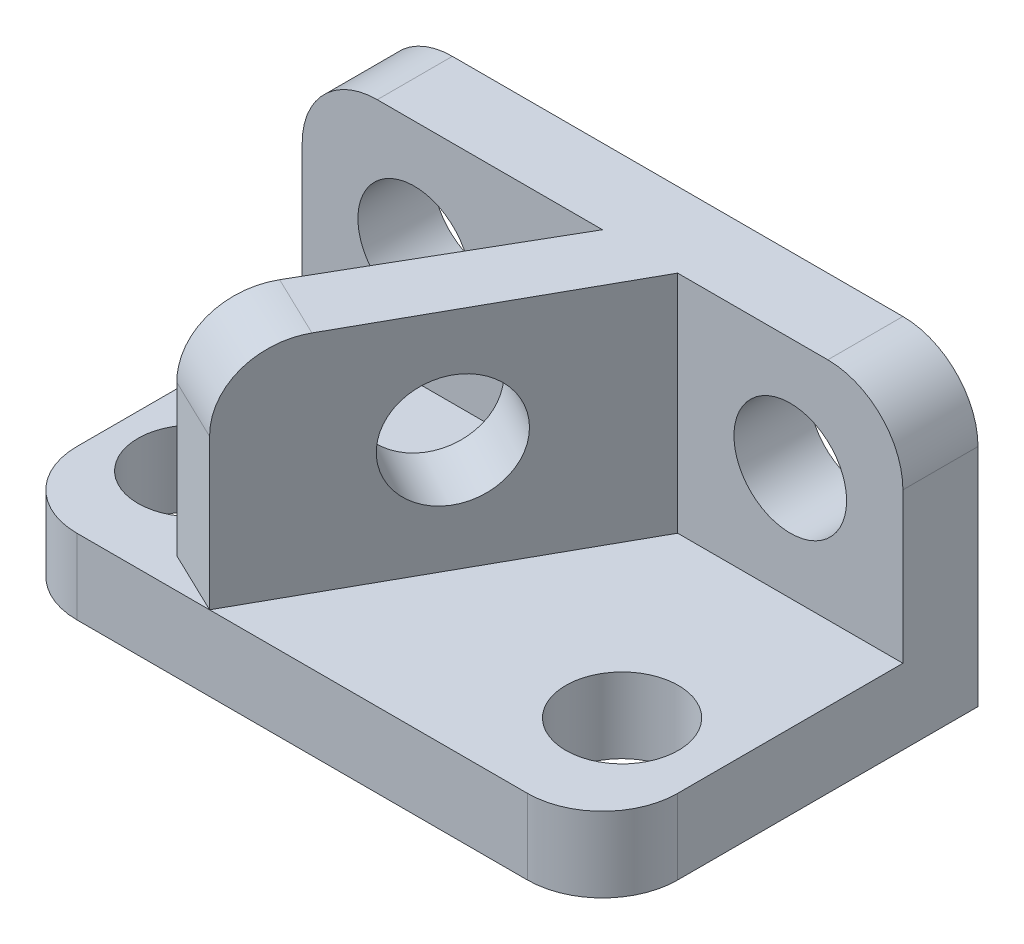
ISO-10303-21;
HEADER;
FILE_DESCRIPTION(('STEP AP214'),'2;1');
FILE_NAME('part.step','',(''),(''),'','','');
FILE_SCHEMA(('AUTOMOTIVE_DESIGN { 1 0 10303 214 1 1 1 1 }'));
ENDSEC;
DATA;
#1=APPLICATION_CONTEXT('core data for automotive mechanical design processes');
#2=APPLICATION_PROTOCOL_DEFINITION('international standard','automotive_design',2000,#1);
#3=PRODUCT_CONTEXT('',#1,'mechanical');
#4=PRODUCT('Part','Part','',(#3));
#5=PRODUCT_RELATED_PRODUCT_CATEGORY('part','',(#4));
#6=PRODUCT_DEFINITION_FORMATION('','',#4);
#7=PRODUCT_DEFINITION_CONTEXT('part definition',#1,'design');
#8=PRODUCT_DEFINITION('design','',#6,#7);
#9=PRODUCT_DEFINITION_SHAPE('','',#8);
#10=(LENGTH_UNIT() NAMED_UNIT(*) SI_UNIT(.MILLI.,.METRE.));
#11=(NAMED_UNIT(*) PLANE_ANGLE_UNIT() SI_UNIT($,.RADIAN.));
#12=(NAMED_UNIT(*) SI_UNIT($,.STERADIAN.) SOLID_ANGLE_UNIT());
#13=UNCERTAINTY_MEASURE_WITH_UNIT(LENGTH_MEASURE(1.E-05),#10,'distance_accuracy_value','');
#14=(GEOMETRIC_REPRESENTATION_CONTEXT(3) GLOBAL_UNCERTAINTY_ASSIGNED_CONTEXT((#13)) GLOBAL_UNIT_ASSIGNED_CONTEXT((#10,
#11,#12)) REPRESENTATION_CONTEXT('',''));
#15=CARTESIAN_POINT('',(0.,0.,0.));
#16=DIRECTION('',(0.,0.,1.));
#17=DIRECTION('',(1.,0.,0.));
#18=AXIS2_PLACEMENT_3D('',#15,#16,#17);
#19=CARTESIAN_POINT('',(-85.9782608695652,-40.,-14.2391304347826));
#20=DIRECTION('',(0.,0.,1.));
#21=DIRECTION('',(1.,0.,0.));
#22=AXIS2_PLACEMENT_3D('',#19,#20,#21);
#23=PLANE('',#22);
#24=CARTESIAN_POINT('',(-20.9782608695653,-15.,-14.2391304347826));
#25=DIRECTION('',(0.,0.,1.));
#26=DIRECTION('',(1.,0.,0.));
#27=AXIS2_PLACEMENT_3D('',#24,#25,#26);
#28=CIRCLE('',#27,7.5);
#29=CARTESIAN_POINT('',(-13.4782608695653,-15.,-14.2391304347826));
#30=VERTEX_POINT('',#29);
#31=EDGE_CURVE('E252',#30,#30,#28,.T.);
#32=ORIENTED_EDGE('',*,*,#31,.F.);
#33=EDGE_LOOP('',(#32));
#34=FACE_BOUND('',#33,.T.);
#35=DIRECTION('',(0.,1.,0.));
#36=VECTOR('',#35,1.);
#37=CARTESIAN_POINT('',(-5.97826086956525,-40.,-14.2391304347826));
#38=LINE('',#37,#36);
#39=CARTESIAN_POINT('',(-5.97826086956525,-30.,-14.2391304347826));
#40=VERTEX_POINT('',#39);
#41=CARTESIAN_POINT('',(-5.97826086956525,-10.,-14.2391304347826));
#42=VERTEX_POINT('',#41);
#43=EDGE_CURVE('E231',#40,#42,#38,.T.);
#44=ORIENTED_EDGE('',*,*,#43,.T.);
#45=CARTESIAN_POINT('',(-15.9782608695652,-10.,-14.2391304347826));
#46=DIRECTION('',(0.,0.,1.));
#47=DIRECTION('',(1.,0.,0.));
#48=AXIS2_PLACEMENT_3D('',#45,#46,#47);
#49=CIRCLE('',#48,10.);
#50=CARTESIAN_POINT('',(-15.9782608695652,0.,-14.2391304347826));
#51=VERTEX_POINT('',#50);
#52=EDGE_CURVE('E280',#42,#51,#49,.T.);
#53=ORIENTED_EDGE('',*,*,#52,.T.);
#54=DIRECTION('',(1.,0.,0.));
#55=VECTOR('',#54,1.);
#56=CARTESIAN_POINT('',(-85.9782608695652,0.,-14.2391304347826));
#57=LINE('',#56,#55);
#58=CARTESIAN_POINT('',(-35.9782608695653,0.,-14.2391304347826));
#59=VERTEX_POINT('',#58);
#60=EDGE_CURVE('E228',#59,#51,#57,.T.);
#61=ORIENTED_EDGE('',*,*,#60,.F.);
#62=DIRECTION('',(0.,-1.,0.));
#63=VECTOR('',#62,1.);
#64=CARTESIAN_POINT('',(-35.9782608695653,0.,-14.2391304347826));
#65=LINE('',#64,#63);
#66=CARTESIAN_POINT('',(-35.9782608695653,-30.,-14.2391304347826));
#67=VERTEX_POINT('',#66);
#68=EDGE_CURVE('E186',#59,#67,#65,.T.);
#69=ORIENTED_EDGE('',*,*,#68,.T.);
#70=DIRECTION('',(-1.,0.,0.));
#71=VECTOR('',#70,1.);
#72=CARTESIAN_POINT('',(-85.9782608695652,-30.,-14.2391304347826));
#73=LINE('',#72,#71);
#74=EDGE_CURVE('E202',#40,#67,#73,.T.);
#75=ORIENTED_EDGE('',*,*,#74,.F.);
#76=EDGE_LOOP('',(#44,#53,#61,#69,#75));
#77=FACE_BOUND('',#76,.T.);
#78=ADVANCED_FACE('F41',(#34,#77),#23,.T.);
#79=CARTESIAN_POINT('',(-71.0572154337967,-15.,-14.2391304347826));
#80=DIRECTION('',(0.,0.,1.));
#81=DIRECTION('',(1.,0.,0.));
#82=AXIS2_PLACEMENT_3D('',#79,#80,#81);
#83=CIRCLE('',#82,7.50000000000001);
#84=CARTESIAN_POINT('',(-63.5572154337967,-15.,-14.2391304347826));
#85=VERTEX_POINT('',#84);
#86=EDGE_CURVE('E449',#85,#85,#83,.T.);
#87=ORIENTED_EDGE('',*,*,#86,.F.);
#88=EDGE_LOOP('',(#87));
#89=FACE_BOUND('',#88,.T.);
#90=CARTESIAN_POINT('',(-75.9782608695653,0.,-14.2391304347826));
#91=VERTEX_POINT('',#90);
#92=CARTESIAN_POINT('',(-45.9782608695652,0.,-14.2391304347826));
#93=VERTEX_POINT('',#92);
#94=EDGE_CURVE('E216',#91,#93,#57,.T.);
#95=ORIENTED_EDGE('',*,*,#94,.F.);
#96=CARTESIAN_POINT('',(-75.9782608695653,-10.,-14.2391304347826));
#97=DIRECTION('',(0.,0.,1.));
#98=DIRECTION('',(1.,0.,0.));
#99=AXIS2_PLACEMENT_3D('',#96,#97,#98);
#100=CIRCLE('',#99,10.);
#101=CARTESIAN_POINT('',(-85.9782608695652,-10.,-14.2391304347826));
#102=VERTEX_POINT('',#101);
#103=EDGE_CURVE('E11',#91,#102,#100,.T.);
#104=ORIENTED_EDGE('',*,*,#103,.T.);
#105=DIRECTION('',(0.,1.,0.));
#106=VECTOR('',#105,1.);
#107=CARTESIAN_POINT('',(-85.9782608695652,-40.,-14.2391304347826));
#108=LINE('',#107,#106);
#109=CARTESIAN_POINT('',(-85.9782608695652,-30.,-14.2391304347826));
#110=VERTEX_POINT('',#109);
#111=EDGE_CURVE('E236',#110,#102,#108,.T.);
#112=ORIENTED_EDGE('',*,*,#111,.F.);
#113=CARTESIAN_POINT('',(-45.9782608695652,-30.,-14.2391304347826));
#114=VERTEX_POINT('',#113);
#115=EDGE_CURVE('E192',#114,#110,#73,.T.);
#116=ORIENTED_EDGE('',*,*,#115,.F.);
#117=DIRECTION('',(0.,-1.,0.));
#118=VECTOR('',#117,1.);
#119=CARTESIAN_POINT('',(-45.9782608695652,0.,-14.2391304347826));
#120=LINE('',#119,#118);
#121=EDGE_CURVE('E155',#93,#114,#120,.T.);
#122=ORIENTED_EDGE('',*,*,#121,.F.);
#123=EDGE_LOOP('',(#95,#104,#112,#116,#122));
#124=FACE_BOUND('',#123,.T.);
#125=ADVANCED_FACE('F336',(#89,#124),#23,.T.);
#126=CARTESIAN_POINT('',(-85.9782608695652,-30.,25.7608695652174));
#127=DIRECTION('',(0.,-1.,0.));
#128=DIRECTION('',(0.,0.,-1.));
#129=AXIS2_PLACEMENT_3D('',#126,#127,#128);
#130=PLANE('',#129);
#131=CARTESIAN_POINT('',(-18.3763957998835,-30.,10.7608695652174));
#132=DIRECTION('',(0.,1.,0.));
#133=DIRECTION('',(0.,0.,1.));
#134=AXIS2_PLACEMENT_3D('',#131,#132,#133);
#135=CIRCLE('',#134,7.5);
#136=CARTESIAN_POINT('',(-18.3763957998835,-30.,18.2608695652174));
#137=VERTEX_POINT('',#136);
#138=EDGE_CURVE('E438',#137,#137,#135,.T.);
#139=ORIENTED_EDGE('',*,*,#138,.F.);
#140=EDGE_LOOP('',(#139));
#141=FACE_BOUND('',#140,.T.);
#142=DIRECTION('',(-1.,0.,0.));
#143=VECTOR('',#142,1.);
#144=CARTESIAN_POINT('',(-85.9782608695652,-30.,25.7608695652174));
#145=LINE('',#144,#143);
#146=CARTESIAN_POINT('',(-15.9782608695652,-30.,25.7608695652174));
#147=VERTEX_POINT('',#146);
#148=CARTESIAN_POINT('',(-58.3128512287718,-30.,25.7608695652174));
#149=VERTEX_POINT('',#148);
#150=EDGE_CURVE('E193',#147,#149,#145,.T.);
#151=ORIENTED_EDGE('',*,*,#150,.F.);
#152=CARTESIAN_POINT('',(-15.9782608695652,-30.,15.7608695652174));
#153=DIRECTION('',(0.,-1.,0.));
#154=DIRECTION('',(0.,0.,-1.));
#155=AXIS2_PLACEMENT_3D('',#152,#153,#154);
#156=CIRCLE('',#155,10.);
#157=CARTESIAN_POINT('',(-5.97826086956525,-30.,15.7608695652174));
#158=VERTEX_POINT('',#157);
#159=EDGE_CURVE('E291',#147,#158,#156,.F.);
#160=ORIENTED_EDGE('',*,*,#159,.T.);
#161=DIRECTION('',(0.,0.,-1.));
#162=VECTOR('',#161,1.);
#163=CARTESIAN_POINT('',(-5.97826086956525,-30.,25.7608695652174));
#164=LINE('',#163,#162);
#165=EDGE_CURVE('E208',#158,#40,#164,.T.);
#166=ORIENTED_EDGE('',*,*,#165,.T.);
#167=ORIENTED_EDGE('',*,*,#74,.T.);
#168=DIRECTION('',(0.487516089824221,0.,-0.873114002958664));
#169=VECTOR('',#168,1.);
#170=CARTESIAN_POINT('',(-33.4882252076734,-30.,-18.698644796756));
#171=LINE('',#170,#169);
#172=EDGE_CURVE('E168',#149,#67,#171,.T.);
#173=ORIENTED_EDGE('',*,*,#172,.F.);
#174=EDGE_LOOP('',(#151,#160,#166,#167,#173));
#175=FACE_BOUND('',#174,.T.);
#176=ADVANCED_FACE('F342',(#141,#175),#130,.F.);
#177=CARTESIAN_POINT('',(-75.3589146694154,-30.,10.7608695652174));
#178=DIRECTION('',(0.,1.,0.));
#179=DIRECTION('',(0.,0.,1.));
#180=AXIS2_PLACEMENT_3D('',#177,#178,#179);
#181=CIRCLE('',#180,7.50000000000001);
#182=CARTESIAN_POINT('',(-75.3589146694154,-30.,18.2608695652174));
#183=VERTEX_POINT('',#182);
#184=EDGE_CURVE('E256',#183,#183,#181,.T.);
#185=ORIENTED_EDGE('',*,*,#184,.F.);
#186=EDGE_LOOP('',(#185));
#187=FACE_BOUND('',#186,.T.);
#188=DIRECTION('',(0.,0.,-1.));
#189=VECTOR('',#188,1.);
#190=CARTESIAN_POINT('',(-85.9782608695652,-30.,25.7608695652174));
#191=LINE('',#190,#189);
#192=CARTESIAN_POINT('',(-85.9782608695652,-30.,15.7608695652174));
#193=VERTEX_POINT('',#192);
#194=EDGE_CURVE('E201',#193,#110,#191,.T.);
#195=ORIENTED_EDGE('',*,*,#194,.F.);
#196=CARTESIAN_POINT('',(-75.9782608695653,-30.,15.7608695652174));
#197=DIRECTION('',(0.,-1.,0.));
#198=DIRECTION('',(0.,0.,-1.));
#199=AXIS2_PLACEMENT_3D('',#196,#197,#198);
#200=CIRCLE('',#199,10.);
#201=CARTESIAN_POINT('',(-75.9782608695653,-30.,25.7608695652174));
#202=VERTEX_POINT('',#201);
#203=EDGE_CURVE('E306',#193,#202,#200,.F.);
#204=ORIENTED_EDGE('',*,*,#203,.T.);
#205=EDGE_CURVE('E166',#149,#202,#145,.T.);
#206=ORIENTED_EDGE('',*,*,#205,.F.);
#207=DIRECTION('',(0.900994385998586,0.,0.433830746258296));
#208=VECTOR('',#207,1.);
#209=CARTESIAN_POINT('',(-21.0443948614313,-30.,43.7057119404766));
#210=LINE('',#209,#208);
#211=CARTESIAN_POINT('',(-66.7318333132097,-30.,21.7071114761712));
#212=VERTEX_POINT('',#211);
#213=EDGE_CURVE('E150',#212,#149,#210,.T.);
#214=ORIENTED_EDGE('',*,*,#213,.F.);
#215=DIRECTION('',(-0.499999999999998,0.,0.86602540378444));
#216=VECTOR('',#215,1.);
#217=CARTESIAN_POINT('',(-40.649419994335,-30.,-23.4689535761313));
#218=LINE('',#217,#216);
#219=EDGE_CURVE('E163',#114,#212,#218,.T.);
#220=ORIENTED_EDGE('',*,*,#219,.F.);
#221=ORIENTED_EDGE('',*,*,#115,.T.);
#222=EDGE_LOOP('',(#195,#204,#206,#214,#220,#221));
#223=FACE_BOUND('',#222,.T.);
#224=ADVANCED_FACE('F161',(#187,#223),#130,.F.);
#225=CARTESIAN_POINT('',(-5.97826086956525,-40.,-24.2391304347826));
#226=DIRECTION('',(1.,0.,0.));
#227=DIRECTION('',(0.,0.,-1.));
#228=AXIS2_PLACEMENT_3D('',#225,#226,#227);
#229=PLANE('',#228);
#230=DIRECTION('',(0.,1.,0.));
#231=VECTOR('',#230,1.);
#232=CARTESIAN_POINT('',(-5.97826086956525,-40.,-24.2391304347826));
#233=LINE('',#232,#231);
#234=CARTESIAN_POINT('',(-5.97826086956525,-40.,-24.2391304347826));
#235=VERTEX_POINT('',#234);
#236=CARTESIAN_POINT('',(-5.97826086956525,-10.,-24.2391304347826));
#237=VERTEX_POINT('',#236);
#238=EDGE_CURVE('E224',#235,#237,#233,.T.);
#239=ORIENTED_EDGE('',*,*,#238,.T.);
#240=DIRECTION('',(0.,0.,-1.));
#241=VECTOR('',#240,1.);
#242=CARTESIAN_POINT('',(-5.97826086956525,-10.,-24.2391304347826));
#243=LINE('',#242,#241);
#244=EDGE_CURVE('E277',#237,#42,#243,.F.);
#245=ORIENTED_EDGE('',*,*,#244,.T.);
#246=ORIENTED_EDGE('',*,*,#43,.F.);
#247=ORIENTED_EDGE('',*,*,#165,.F.);
#248=DIRECTION('',(0.,1.,0.));
#249=VECTOR('',#248,1.);
#250=CARTESIAN_POINT('',(-5.97826086956525,-40.,15.7608695652174));
#251=LINE('',#250,#249);
#252=CARTESIAN_POINT('',(-5.97826086956525,-40.,15.7608695652174));
#253=VERTEX_POINT('',#252);
#254=EDGE_CURVE('E274',#158,#253,#251,.F.);
#255=ORIENTED_EDGE('',*,*,#254,.T.);
#256=DIRECTION('',(0.,0.,-1.));
#257=VECTOR('',#256,1.);
#258=CARTESIAN_POINT('',(-5.97826086956525,-40.,-24.2391304347826));
#259=LINE('',#258,#257);
#260=EDGE_CURVE('E212',#253,#235,#259,.T.);
#261=ORIENTED_EDGE('',*,*,#260,.T.);
#262=EDGE_LOOP('',(#239,#245,#246,#247,#255,#261));
#263=FACE_BOUND('',#262,.T.);
#264=ADVANCED_FACE('F353',(#263),#229,.T.);
#265=CARTESIAN_POINT('',(-85.9782608695652,-40.,-24.2391304347826));
#266=DIRECTION('',(-1.,0.,0.));
#267=DIRECTION('',(0.,0.,1.));
#268=AXIS2_PLACEMENT_3D('',#265,#266,#267);
#269=PLANE('',#268);
#270=DIRECTION('',(0.,0.,1.));
#271=VECTOR('',#270,1.);
#272=CARTESIAN_POINT('',(-85.9782608695652,-40.,-24.2391304347826));
#273=LINE('',#272,#271);
#274=CARTESIAN_POINT('',(-85.9782608695652,-40.,-24.2391304347826));
#275=VERTEX_POINT('',#274);
#276=CARTESIAN_POINT('',(-85.9782608695652,-40.,15.7608695652174));
#277=VERTEX_POINT('',#276);
#278=EDGE_CURVE('E220',#275,#277,#273,.T.);
#279=ORIENTED_EDGE('',*,*,#278,.T.);
#280=DIRECTION('',(0.,-1.,0.));
#281=VECTOR('',#280,1.);
#282=CARTESIAN_POINT('',(-85.9782608695652,-40.,15.7608695652174));
#283=LINE('',#282,#281);
#284=EDGE_CURVE('E303',#277,#193,#283,.F.);
#285=ORIENTED_EDGE('',*,*,#284,.T.);
#286=ORIENTED_EDGE('',*,*,#194,.T.);
#287=ORIENTED_EDGE('',*,*,#111,.T.);
#288=DIRECTION('',(0.,0.,1.));
#289=VECTOR('',#288,1.);
#290=CARTESIAN_POINT('',(-85.9782608695652,-10.,-24.2391304347826));
#291=LINE('',#290,#289);
#292=CARTESIAN_POINT('',(-85.9782608695652,-10.,-24.2391304347826));
#293=VERTEX_POINT('',#292);
#294=EDGE_CURVE('E300',#102,#293,#291,.F.);
#295=ORIENTED_EDGE('',*,*,#294,.T.);
#296=DIRECTION('',(0.,1.,0.));
#297=VECTOR('',#296,1.);
#298=CARTESIAN_POINT('',(-85.9782608695652,-40.,-24.2391304347826));
#299=LINE('',#298,#297);
#300=EDGE_CURVE('E240',#275,#293,#299,.T.);
#301=ORIENTED_EDGE('',*,*,#300,.F.);
#302=EDGE_LOOP('',(#279,#285,#286,#287,#295,#301));
#303=FACE_BOUND('',#302,.T.);
#304=ADVANCED_FACE('F349',(#303),#269,.T.);
#305=CARTESIAN_POINT('',(-85.9782608695652,-40.,-24.2391304347826));
#306=DIRECTION('',(0.,0.,-1.));
#307=DIRECTION('',(-1.,0.,0.));
#308=AXIS2_PLACEMENT_3D('',#305,#306,#307);
#309=PLANE('',#308);
#310=CARTESIAN_POINT('',(-20.9782608695653,-15.,-24.2391304347826));
#311=DIRECTION('',(0.,0.,-1.));
#312=DIRECTION('',(-1.,0.,0.));
#313=AXIS2_PLACEMENT_3D('',#310,#311,#312);
#314=CIRCLE('',#313,7.5);
#315=CARTESIAN_POINT('',(-28.4782608695653,-15.,-24.2391304347826));
#316=VERTEX_POINT('',#315);
#317=EDGE_CURVE('E251',#316,#316,#314,.T.);
#318=ORIENTED_EDGE('',*,*,#317,.F.);
#319=EDGE_LOOP('',(#318));
#320=FACE_BOUND('',#319,.T.);
#321=CARTESIAN_POINT('',(-71.0572154337967,-15.,-24.2391304347826));
#322=DIRECTION('',(0.,0.,-1.));
#323=DIRECTION('',(-1.,0.,0.));
#324=AXIS2_PLACEMENT_3D('',#321,#322,#323);
#325=CIRCLE('',#324,7.50000000000001);
#326=CARTESIAN_POINT('',(-78.5572154337967,-15.,-24.2391304347826));
#327=VERTEX_POINT('',#326);
#328=EDGE_CURVE('E247',#327,#327,#325,.T.);
#329=ORIENTED_EDGE('',*,*,#328,.F.);
#330=EDGE_LOOP('',(#329));
#331=FACE_BOUND('',#330,.T.);
#332=DIRECTION('',(-1.,0.,0.));
#333=VECTOR('',#332,1.);
#334=CARTESIAN_POINT('',(-85.9782608695652,0.,-24.2391304347826));
#335=LINE('',#334,#333);
#336=CARTESIAN_POINT('',(-15.9782608695652,0.,-24.2391304347826));
#337=VERTEX_POINT('',#336);
#338=CARTESIAN_POINT('',(-75.9782608695653,0.,-24.2391304347826));
#339=VERTEX_POINT('',#338);
#340=EDGE_CURVE('E211',#337,#339,#335,.T.);
#341=ORIENTED_EDGE('',*,*,#340,.F.);
#342=CARTESIAN_POINT('',(-15.9782608695652,-10.,-24.2391304347826));
#343=DIRECTION('',(0.,0.,-1.));
#344=DIRECTION('',(-1.,0.,0.));
#345=AXIS2_PLACEMENT_3D('',#342,#343,#344);
#346=CIRCLE('',#345,10.);
#347=EDGE_CURVE('E271',#337,#237,#346,.T.);
#348=ORIENTED_EDGE('',*,*,#347,.T.);
#349=ORIENTED_EDGE('',*,*,#238,.F.);
#350=DIRECTION('',(-1.,0.,0.));
#351=VECTOR('',#350,1.);
#352=CARTESIAN_POINT('',(-85.9782608695652,-40.,-24.2391304347826));
#353=LINE('',#352,#351);
#354=EDGE_CURVE('E215',#235,#275,#353,.T.);
#355=ORIENTED_EDGE('',*,*,#354,.T.);
#356=ORIENTED_EDGE('',*,*,#300,.T.);
#357=CARTESIAN_POINT('',(-75.9782608695653,-10.,-24.2391304347826));
#358=DIRECTION('',(0.,0.,-1.));
#359=DIRECTION('',(-1.,0.,0.));
#360=AXIS2_PLACEMENT_3D('',#357,#358,#359);
#361=CIRCLE('',#360,10.);
#362=EDGE_CURVE('E268',#293,#339,#361,.T.);
#363=ORIENTED_EDGE('',*,*,#362,.T.);
#364=EDGE_LOOP('',(#341,#348,#349,#355,#356,#363));
#365=FACE_BOUND('',#364,.T.);
#366=ADVANCED_FACE('F352',(#320,#331,#365),#309,.T.);
#367=CARTESIAN_POINT('',(0.,-40.,0.));
#368=DIRECTION('',(0.,1.,0.));
#369=DIRECTION('',(0.,0.,1.));
#370=AXIS2_PLACEMENT_3D('',#367,#368,#369);
#371=PLANE('',#370);
#372=CARTESIAN_POINT('',(-18.3763957998835,-40.,10.7608695652174));
#373=DIRECTION('',(0.,1.,0.));
#374=DIRECTION('',(0.,0.,1.));
#375=AXIS2_PLACEMENT_3D('',#372,#373,#374);
#376=CIRCLE('',#375,7.5);
#377=CARTESIAN_POINT('',(-18.3763957998835,-40.,18.2608695652174));
#378=VERTEX_POINT('',#377);
#379=EDGE_CURVE('E169',#378,#378,#376,.T.);
#380=ORIENTED_EDGE('',*,*,#379,.T.);
#381=EDGE_LOOP('',(#380));
#382=FACE_BOUND('',#381,.T.);
#383=CARTESIAN_POINT('',(-75.3589146694154,-40.,10.7608695652174));
#384=DIRECTION('',(0.,1.,0.));
#385=DIRECTION('',(0.,0.,1.));
#386=AXIS2_PLACEMENT_3D('',#383,#384,#385);
#387=CIRCLE('',#386,7.50000000000001);
#388=CARTESIAN_POINT('',(-75.3589146694154,-40.,18.2608695652174));
#389=VERTEX_POINT('',#388);
#390=EDGE_CURVE('E435',#389,#389,#387,.T.);
#391=ORIENTED_EDGE('',*,*,#390,.T.);
#392=EDGE_LOOP('',(#391));
#393=FACE_BOUND('',#392,.T.);
#394=ORIENTED_EDGE('',*,*,#260,.F.);
#395=CARTESIAN_POINT('',(-15.9782608695652,-40.,15.7608695652174));
#396=DIRECTION('',(0.,1.,0.));
#397=DIRECTION('',(0.,0.,1.));
#398=AXIS2_PLACEMENT_3D('',#395,#396,#397);
#399=CIRCLE('',#398,10.);
#400=CARTESIAN_POINT('',(-15.9782608695652,-40.,25.7608695652174));
#401=VERTEX_POINT('',#400);
#402=EDGE_CURVE('E297',#253,#401,#399,.F.);
#403=ORIENTED_EDGE('',*,*,#402,.T.);
#404=DIRECTION('',(1.,0.,0.));
#405=VECTOR('',#404,1.);
#406=CARTESIAN_POINT('',(-85.9782608695652,-40.,25.7608695652174));
#407=LINE('',#406,#405);
#408=CARTESIAN_POINT('',(-75.9782608695653,-40.,25.7608695652174));
#409=VERTEX_POINT('',#408);
#410=EDGE_CURVE('E197',#409,#401,#407,.T.);
#411=ORIENTED_EDGE('',*,*,#410,.F.);
#412=CARTESIAN_POINT('',(-75.9782608695653,-40.,15.7608695652174));
#413=DIRECTION('',(0.,1.,0.));
#414=DIRECTION('',(0.,0.,1.));
#415=AXIS2_PLACEMENT_3D('',#412,#413,#414);
#416=CIRCLE('',#415,10.);
#417=EDGE_CURVE('E294',#409,#277,#416,.F.);
#418=ORIENTED_EDGE('',*,*,#417,.T.);
#419=ORIENTED_EDGE('',*,*,#278,.F.);
#420=ORIENTED_EDGE('',*,*,#354,.F.);
#421=EDGE_LOOP('',(#394,#403,#411,#418,#419,#420));
#422=FACE_BOUND('',#421,.T.);
#423=ADVANCED_FACE('F357',(#382,#393,#422),#371,.F.);
#424=CARTESIAN_POINT('',(0.,0.,0.));
#425=DIRECTION('',(0.,1.,0.));
#426=DIRECTION('',(0.,0.,1.));
#427=AXIS2_PLACEMENT_3D('',#424,#425,#426);
#428=PLANE('',#427);
#429=ORIENTED_EDGE('',*,*,#60,.T.);
#430=DIRECTION('',(0.,0.,-1.));
#431=VECTOR('',#430,1.);
#432=CARTESIAN_POINT('',(-15.9782608695652,0.,0.));
#433=LINE('',#432,#431);
#434=EDGE_CURVE('E264',#51,#337,#433,.T.);
#435=ORIENTED_EDGE('',*,*,#434,.T.);
#436=ORIENTED_EDGE('',*,*,#340,.T.);
#437=DIRECTION('',(0.,0.,1.));
#438=VECTOR('',#437,1.);
#439=CARTESIAN_POINT('',(-75.9782608695653,0.,0.));
#440=LINE('',#439,#438);
#441=EDGE_CURVE('E235',#339,#91,#440,.T.);
#442=ORIENTED_EDGE('',*,*,#441,.T.);
#443=ORIENTED_EDGE('',*,*,#94,.T.);
#444=DIRECTION('',(-0.499999999999998,0.,0.86602540378444));
#445=VECTOR('',#444,1.);
#446=CARTESIAN_POINT('',(-40.649419994335,0.,-23.4689535761313));
#447=LINE('',#446,#445);
#448=CARTESIAN_POINT('',(-61.7177909866264,0.,13.0225354152279));
#449=VERTEX_POINT('',#448);
#450=EDGE_CURVE('E156',#93,#449,#447,.T.);
#451=ORIENTED_EDGE('',*,*,#450,.T.);
#452=DIRECTION('',(0.900994385998586,0.,0.433830746258296));
#453=VECTOR('',#452,1.);
#454=CARTESIAN_POINT('',(-53.9745437661889,0.,16.7509257052315));
#455=LINE('',#454,#453);
#456=CARTESIAN_POINT('',(-53.4287538196666,0.,17.0137247453583));
#457=VERTEX_POINT('',#456);
#458=EDGE_CURVE('E260',#449,#457,#455,.T.);
#459=ORIENTED_EDGE('',*,*,#458,.T.);
#460=DIRECTION('',(0.487516089824221,0.,-0.873114002958664));
#461=VECTOR('',#460,1.);
#462=CARTESIAN_POINT('',(-33.4882252076734,0.,-18.698644796756));
#463=LINE('',#462,#461);
#464=EDGE_CURVE('E176',#457,#59,#463,.T.);
#465=ORIENTED_EDGE('',*,*,#464,.T.);
#466=EDGE_LOOP('',(#429,#435,#436,#442,#443,#451,#459,#465));
#467=FACE_BOUND('',#466,.T.);
#468=ADVANCED_FACE('F319',(#467),#428,.T.);
#469=CARTESIAN_POINT('',(0.,0.,25.7608695652174));
#470=DIRECTION('',(0.,0.,1.));
#471=DIRECTION('',(1.,0.,0.));
#472=AXIS2_PLACEMENT_3D('',#469,#470,#471);
#473=PLANE('',#472);
#474=ORIENTED_EDGE('',*,*,#410,.T.);
#475=DIRECTION('',(0.,1.,0.));
#476=VECTOR('',#475,1.);
#477=CARTESIAN_POINT('',(-15.9782608695652,0.,25.7608695652174));
#478=LINE('',#477,#476);
#479=EDGE_CURVE('E287',#401,#147,#478,.T.);
#480=ORIENTED_EDGE('',*,*,#479,.T.);
#481=ORIENTED_EDGE('',*,*,#150,.T.);
#482=ORIENTED_EDGE('',*,*,#205,.T.);
#483=DIRECTION('',(0.,-1.,0.));
#484=VECTOR('',#483,1.);
#485=CARTESIAN_POINT('',(-75.9782608695653,0.,25.7608695652174));
#486=LINE('',#485,#484);
#487=EDGE_CURVE('E283',#202,#409,#486,.T.);
#488=ORIENTED_EDGE('',*,*,#487,.T.);
#489=EDGE_LOOP('',(#474,#480,#481,#482,#488));
#490=FACE_BOUND('',#489,.T.);
#491=ADVANCED_FACE('F379',(#490),#473,.T.);
#492=CARTESIAN_POINT('',(-21.0443948614313,0.,43.7057119404766));
#493=DIRECTION('',(0.433830746258296,0.,-0.900994385998586));
#494=DIRECTION('',(-0.900994385998586,0.,-0.433830746258296));
#495=AXIS2_PLACEMENT_3D('',#492,#493,#494);
#496=PLANE('',#495);
#497=DIRECTION('',(0.,-1.,0.));
#498=VECTOR('',#497,1.);
#499=CARTESIAN_POINT('',(-58.3128512287718,0.,25.7608695652174));
#500=LINE('',#499,#498);
#501=CARTESIAN_POINT('',(-58.3128512287718,-10.,25.7608695652174));
#502=VERTEX_POINT('',#501);
#503=EDGE_CURVE('E189',#502,#149,#500,.T.);
#504=ORIENTED_EDGE('',*,*,#503,.F.);
#505=DIRECTION('',(0.900994385998586,0.,0.433830746258296));
#506=VECTOR('',#505,1.);
#507=CARTESIAN_POINT('',(-66.7318333132097,-10.,21.7071114761712));
#508=LINE('',#507,#506);
#509=CARTESIAN_POINT('',(-66.7318333132097,-10.,21.7071114761712));
#510=VERTEX_POINT('',#509);
#511=EDGE_CURVE('E58',#502,#510,#508,.F.);
#512=ORIENTED_EDGE('',*,*,#511,.T.);
#513=DIRECTION('',(0.,-1.,0.));
#514=VECTOR('',#513,1.);
#515=CARTESIAN_POINT('',(-66.7318333132097,0.,21.7071114761712));
#516=LINE('',#515,#514);
#517=EDGE_CURVE('E147',#510,#212,#516,.T.);
#518=ORIENTED_EDGE('',*,*,#517,.T.);
#519=ORIENTED_EDGE('',*,*,#213,.T.);
#520=EDGE_LOOP('',(#504,#512,#518,#519));
#521=FACE_BOUND('',#520,.T.);
#522=ADVANCED_FACE('F149',(#521),#496,.F.);
#523=CARTESIAN_POINT('',(-33.4882252076734,0.,-18.698644796756));
#524=DIRECTION('',(-0.873114002958664,0.,-0.487516089824221));
#525=DIRECTION('',(-0.487516089824221,0.,0.873114002958664));
#526=AXIS2_PLACEMENT_3D('',#523,#524,#525);
#527=PLANE('',#526);
#528=CARTESIAN_POINT('',(-46.7036148456981,-15.,4.96937763030798));
#529=DIRECTION('',(0.873114002958664,0.,0.487516089824221));
#530=DIRECTION('',(0.487516089824221,0.,-0.873114002958664));
#531=AXIS2_PLACEMENT_3D('',#528,#529,#530);
#532=CIRCLE('',#531,7.5);
#533=CARTESIAN_POINT('',(-43.0472441720165,-15.,-1.578977391882));
#534=VERTEX_POINT('',#533);
#535=EDGE_CURVE('E456',#534,#534,#532,.T.);
#536=ORIENTED_EDGE('',*,*,#535,.F.);
#537=EDGE_LOOP('',(#536));
#538=FACE_BOUND('',#537,.T.);
#539=ORIENTED_EDGE('',*,*,#464,.F.);
#540=CARTESIAN_POINT('',(-53.4287538196666,-10.,17.0137247453583));
#541=DIRECTION('',(-0.873114002958664,0.,-0.487516089824221));
#542=DIRECTION('',(-0.487516089824221,0.,0.873114002958664));
#543=AXIS2_PLACEMENT_3D('',#540,#541,#542);
#544=ELLIPSE('',#543,10.0183306993339,10.);
#545=EDGE_CURVE('E66',#457,#502,#544,.F.);
#546=ORIENTED_EDGE('',*,*,#545,.T.);
#547=ORIENTED_EDGE('',*,*,#503,.T.);
#548=ORIENTED_EDGE('',*,*,#172,.T.);
#549=ORIENTED_EDGE('',*,*,#68,.F.);
#550=EDGE_LOOP('',(#539,#546,#547,#548,#549));
#551=FACE_BOUND('',#550,.T.);
#552=ADVANCED_FACE('F406',(#538,#551),#527,.F.);
#553=CARTESIAN_POINT('',(-40.649419994335,0.,-23.4689535761313));
#554=DIRECTION('',(0.86602540378444,0.,0.499999999999998));
#555=DIRECTION('',(0.499999999999998,0.,-0.86602540378444));
#556=AXIS2_PLACEMENT_3D('',#553,#554,#555);
#557=PLANE('',#556);
#558=CARTESIAN_POINT('',(-54.5415628526638,-15.,0.59294368049952));
#559=DIRECTION('',(0.86602540378444,0.,0.499999999999998));
#560=DIRECTION('',(0.499999999999998,0.,-0.86602540378444));
#561=AXIS2_PLACEMENT_3D('',#558,#559,#560);
#562=ELLIPSE('',#561,7.50077294059331,7.5);
#563=CARTESIAN_POINT('',(-50.7911763823672,-15.,-5.9029162340732));
#564=VERTEX_POINT('',#563);
#565=EDGE_CURVE('E45',#564,#564,#562,.T.);
#566=ORIENTED_EDGE('',*,*,#565,.T.);
#567=EDGE_LOOP('',(#566));
#568=FACE_BOUND('',#567,.T.);
#569=ORIENTED_EDGE('',*,*,#517,.F.);
#570=CARTESIAN_POINT('',(-61.7177909866264,-10.,13.0225354152279));
#571=DIRECTION('',(0.86602540378444,0.,0.499999999999998));
#572=DIRECTION('',(-0.499999999999998,0.,0.86602540378444));
#573=AXIS2_PLACEMENT_3D('',#570,#571,#572);
#574=ELLIPSE('',#573,10.0280846531668,10.);
#575=EDGE_CURVE('E51',#510,#449,#574,.F.);
#576=ORIENTED_EDGE('',*,*,#575,.T.);
#577=ORIENTED_EDGE('',*,*,#450,.F.);
#578=ORIENTED_EDGE('',*,*,#121,.T.);
#579=ORIENTED_EDGE('',*,*,#219,.T.);
#580=EDGE_LOOP('',(#569,#576,#577,#578,#579));
#581=FACE_BOUND('',#580,.T.);
#582=ADVANCED_FACE('F172',(#568,#581),#557,.F.);
#583=CARTESIAN_POINT('',(-75.3589146694154,-40.,10.7608695652174));
#584=DIRECTION('',(0.,1.,0.));
#585=DIRECTION('',(0.,0.,1.));
#586=AXIS2_PLACEMENT_3D('',#583,#584,#585);
#587=CYLINDRICAL_SURFACE('',#586,7.50000000000001);
#588=ORIENTED_EDGE('',*,*,#390,.F.);
#589=EDGE_LOOP('',(#588));
#590=FACE_BOUND('',#589,.T.);
#591=ORIENTED_EDGE('',*,*,#184,.T.);
#592=EDGE_LOOP('',(#591));
#593=FACE_BOUND('',#592,.T.);
#594=ADVANCED_FACE('F414',(#590,#593),#587,.F.);
#595=CARTESIAN_POINT('',(-18.3763957998835,-40.,10.7608695652174));
#596=DIRECTION('',(0.,1.,0.));
#597=DIRECTION('',(0.,0.,1.));
#598=AXIS2_PLACEMENT_3D('',#595,#596,#597);
#599=CYLINDRICAL_SURFACE('',#598,7.5);
#600=ORIENTED_EDGE('',*,*,#379,.F.);
#601=EDGE_LOOP('',(#600));
#602=FACE_BOUND('',#601,.T.);
#603=ORIENTED_EDGE('',*,*,#138,.T.);
#604=EDGE_LOOP('',(#603));
#605=FACE_BOUND('',#604,.T.);
#606=ADVANCED_FACE('F475',(#602,#605),#599,.F.);
#607=CARTESIAN_POINT('',(-71.0572154337967,-15.,-44.2391304347826));
#608=DIRECTION('',(0.,0.,1.));
#609=DIRECTION('',(1.,0.,0.));
#610=AXIS2_PLACEMENT_3D('',#607,#608,#609);
#611=CYLINDRICAL_SURFACE('',#610,7.50000000000001);
#612=ORIENTED_EDGE('',*,*,#328,.T.);
#613=EDGE_LOOP('',(#612));
#614=FACE_BOUND('',#613,.T.);
#615=ORIENTED_EDGE('',*,*,#86,.T.);
#616=EDGE_LOOP('',(#615));
#617=FACE_BOUND('',#616,.T.);
#618=ADVANCED_FACE('F471',(#614,#617),#611,.F.);
#619=CARTESIAN_POINT('',(-20.9782608695653,-15.,-44.2391304347826));
#620=DIRECTION('',(0.,0.,1.));
#621=DIRECTION('',(1.,0.,0.));
#622=AXIS2_PLACEMENT_3D('',#619,#620,#621);
#623=CYLINDRICAL_SURFACE('',#622,7.5);
#624=ORIENTED_EDGE('',*,*,#317,.T.);
#625=EDGE_LOOP('',(#624));
#626=FACE_BOUND('',#625,.T.);
#627=ORIENTED_EDGE('',*,*,#31,.T.);
#628=EDGE_LOOP('',(#627));
#629=FACE_BOUND('',#628,.T.);
#630=ADVANCED_FACE('F365',(#626,#629),#623,.F.);
#631=CARTESIAN_POINT('',(-15.9782608695652,-10.,0.));
#632=DIRECTION('',(0.,0.,-1.));
#633=DIRECTION('',(-1.,0.,0.));
#634=AXIS2_PLACEMENT_3D('',#631,#632,#633);
#635=CYLINDRICAL_SURFACE('',#634,10.);
#636=ORIENTED_EDGE('',*,*,#52,.F.);
#637=ORIENTED_EDGE('',*,*,#244,.F.);
#638=ORIENTED_EDGE('',*,*,#347,.F.);
#639=ORIENTED_EDGE('',*,*,#434,.F.);
#640=EDGE_LOOP('',(#636,#637,#638,#639));
#641=FACE_BOUND('',#640,.T.);
#642=ADVANCED_FACE('F362',(#641),#635,.T.);
#643=CARTESIAN_POINT('',(-15.9782608695652,0.,15.7608695652174));
#644=DIRECTION('',(0.,1.,0.));
#645=DIRECTION('',(0.,0.,1.));
#646=AXIS2_PLACEMENT_3D('',#643,#644,#645);
#647=CYLINDRICAL_SURFACE('',#646,10.);
#648=ORIENTED_EDGE('',*,*,#402,.F.);
#649=ORIENTED_EDGE('',*,*,#254,.F.);
#650=ORIENTED_EDGE('',*,*,#159,.F.);
#651=ORIENTED_EDGE('',*,*,#479,.F.);
#652=EDGE_LOOP('',(#648,#649,#650,#651));
#653=FACE_BOUND('',#652,.T.);
#654=ADVANCED_FACE('F332',(#653),#647,.T.);
#655=CARTESIAN_POINT('',(-75.9782608695653,0.,15.7608695652174));
#656=DIRECTION('',(0.,-1.,0.));
#657=DIRECTION('',(0.,0.,-1.));
#658=AXIS2_PLACEMENT_3D('',#655,#656,#657);
#659=CYLINDRICAL_SURFACE('',#658,10.);
#660=ORIENTED_EDGE('',*,*,#203,.F.);
#661=ORIENTED_EDGE('',*,*,#284,.F.);
#662=ORIENTED_EDGE('',*,*,#417,.F.);
#663=ORIENTED_EDGE('',*,*,#487,.F.);
#664=EDGE_LOOP('',(#660,#661,#662,#663));
#665=FACE_BOUND('',#664,.T.);
#666=ADVANCED_FACE('F325',(#665),#659,.T.);
#667=CARTESIAN_POINT('',(-16.7060873988483,-10.,34.6957680804907));
#668=DIRECTION('',(-0.900994385998586,0.,-0.433830746258296));
#669=DIRECTION('',(-0.433830746258296,0.,0.900994385998586));
#670=AXIS2_PLACEMENT_3D('',#667,#668,#669);
#671=CYLINDRICAL_SURFACE('',#670,10.);
#672=ORIENTED_EDGE('',*,*,#575,.F.);
#673=ORIENTED_EDGE('',*,*,#511,.F.);
#674=ORIENTED_EDGE('',*,*,#545,.F.);
#675=ORIENTED_EDGE('',*,*,#458,.F.);
#676=EDGE_LOOP('',(#672,#673,#674,#675));
#677=FACE_BOUND('',#676,.T.);
#678=ADVANCED_FACE('F323',(#677),#671,.T.);
#679=CARTESIAN_POINT('',(-75.9782608695653,-10.,0.));
#680=DIRECTION('',(0.,0.,1.));
#681=DIRECTION('',(1.,0.,0.));
#682=AXIS2_PLACEMENT_3D('',#679,#680,#681);
#683=CYLINDRICAL_SURFACE('',#682,10.);
#684=ORIENTED_EDGE('',*,*,#362,.F.);
#685=ORIENTED_EDGE('',*,*,#294,.F.);
#686=ORIENTED_EDGE('',*,*,#103,.F.);
#687=ORIENTED_EDGE('',*,*,#441,.F.);
#688=EDGE_LOOP('',(#684,#685,#686,#687));
#689=FACE_BOUND('',#688,.T.);
#690=ADVANCED_FACE('F43',(#689),#683,.T.);
#691=CARTESIAN_POINT('',(-57.1809828812021,-15.,-0.880815447582666));
#692=DIRECTION('',(0.873114002958664,0.,0.487516089824221));
#693=DIRECTION('',(0.487516089824221,0.,-0.873114002958664));
#694=AXIS2_PLACEMENT_3D('',#691,#692,#693);
#695=CYLINDRICAL_SURFACE('',#694,7.5);
#696=ORIENTED_EDGE('',*,*,#535,.T.);
#697=EDGE_LOOP('',(#696));
#698=FACE_BOUND('',#697,.T.);
#699=ORIENTED_EDGE('',*,*,#565,.F.);
#700=EDGE_LOOP('',(#699));
#701=FACE_BOUND('',#700,.T.);
#702=ADVANCED_FACE('F330',(#698,#701),#695,.F.);
#703=CLOSED_SHELL('',(#78,#125,#176,#224,#264,#304,#366,#423,#468,#491,#522,#552,#582,#594,#606,
#618,#630,#642,#654,#666,#678,#690,#702));
#704=MANIFOLD_SOLID_BREP('B2',#703);
#705=ADVANCED_BREP_SHAPE_REPRESENTATION('',(#18,#704),#14);
#706=SHAPE_DEFINITION_REPRESENTATION(#9,#705);
ENDSEC;
END-ISO-10303-21;
